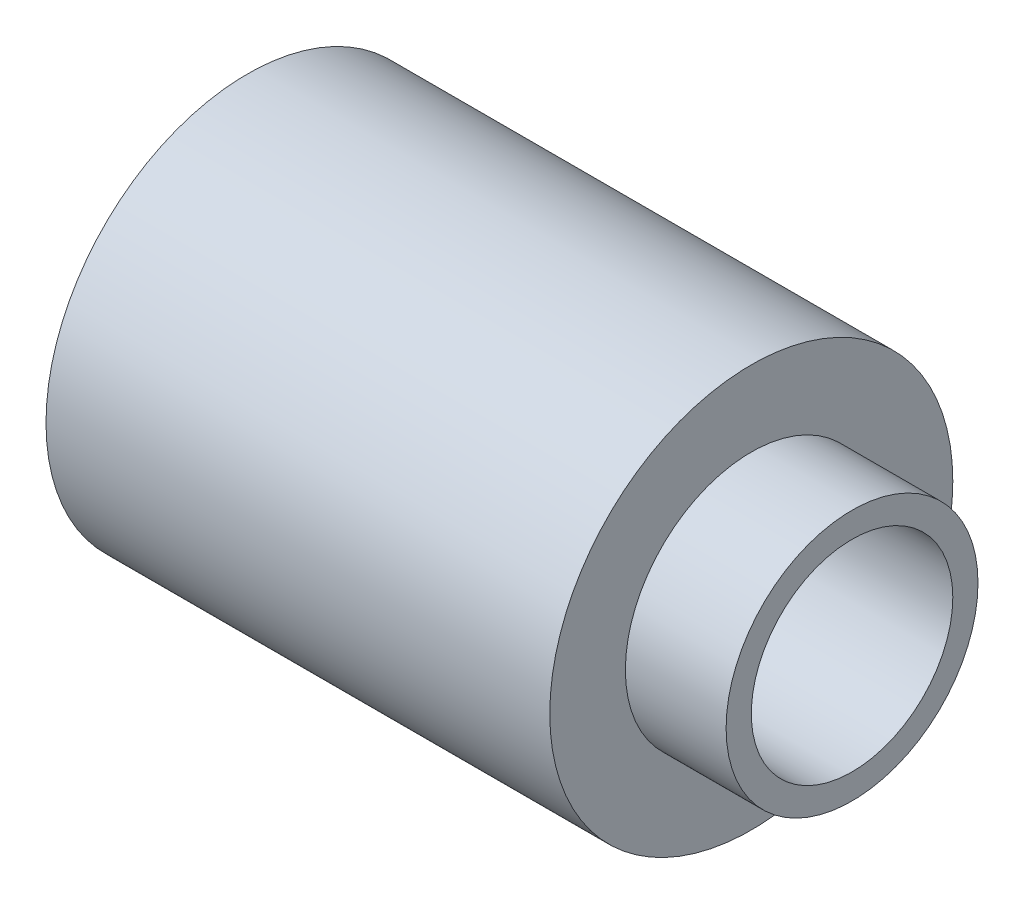
ISO-10303-21;
HEADER;
FILE_DESCRIPTION(('STEP AP214'),'2;1');
FILE_NAME('part.step','',(''),(''),'','','');
FILE_SCHEMA(('AUTOMOTIVE_DESIGN { 1 0 10303 214 1 1 1 1 }'));
ENDSEC;
DATA;
#1=APPLICATION_CONTEXT('core data for automotive mechanical design processes');
#2=APPLICATION_PROTOCOL_DEFINITION('international standard','automotive_design',2000,#1);
#3=PRODUCT_CONTEXT('',#1,'mechanical');
#4=PRODUCT('Part','Part','',(#3));
#5=PRODUCT_RELATED_PRODUCT_CATEGORY('part','',(#4));
#6=PRODUCT_DEFINITION_FORMATION('','',#4);
#7=PRODUCT_DEFINITION_CONTEXT('part definition',#1,'design');
#8=PRODUCT_DEFINITION('design','',#6,#7);
#9=PRODUCT_DEFINITION_SHAPE('','',#8);
#10=(LENGTH_UNIT() NAMED_UNIT(*) SI_UNIT(.MILLI.,.METRE.));
#11=(NAMED_UNIT(*) PLANE_ANGLE_UNIT() SI_UNIT($,.RADIAN.));
#12=(NAMED_UNIT(*) SI_UNIT($,.STERADIAN.) SOLID_ANGLE_UNIT());
#13=UNCERTAINTY_MEASURE_WITH_UNIT(LENGTH_MEASURE(1.E-05),#10,'distance_accuracy_value','');
#14=(GEOMETRIC_REPRESENTATION_CONTEXT(3) GLOBAL_UNCERTAINTY_ASSIGNED_CONTEXT((#13)) GLOBAL_UNIT_ASSIGNED_CONTEXT((#10,
#11,#12)) REPRESENTATION_CONTEXT('',''));
#15=CARTESIAN_POINT('',(0.,0.,0.));
#16=DIRECTION('',(0.,0.,1.));
#17=DIRECTION('',(1.,0.,0.));
#18=AXIS2_PLACEMENT_3D('',#15,#16,#17);
#19=CARTESIAN_POINT('',(10.,0.,0.));
#20=DIRECTION('',(1.,0.,0.));
#21=DIRECTION('',(0.,0.,-1.));
#22=AXIS2_PLACEMENT_3D('',#19,#20,#21);
#23=PLANE('',#22);
#24=CARTESIAN_POINT('',(10.,0.,0.));
#25=DIRECTION('',(1.,0.,0.));
#26=DIRECTION('',(0.,0.,-1.));
#27=AXIS2_PLACEMENT_3D('',#24,#25,#26);
#28=CIRCLE('',#27,4.);
#29=CARTESIAN_POINT('',(10.,0.,-4.));
#30=VERTEX_POINT('',#29);
#31=EDGE_CURVE('E10',#30,#30,#28,.T.);
#32=ORIENTED_EDGE('',*,*,#31,.T.);
#33=EDGE_LOOP('',(#32));
#34=FACE_BOUND('',#33,.T.);
#35=CARTESIAN_POINT('',(10.,0.,0.));
#36=DIRECTION('',(1.,0.,0.));
#37=DIRECTION('',(0.,0.,-1.));
#38=AXIS2_PLACEMENT_3D('',#35,#36,#37);
#39=CIRCLE('',#38,2.5);
#40=CARTESIAN_POINT('',(10.,0.,-2.5));
#41=VERTEX_POINT('',#40);
#42=EDGE_CURVE('E46',#41,#41,#39,.T.);
#43=ORIENTED_EDGE('',*,*,#42,.F.);
#44=EDGE_LOOP('',(#43));
#45=FACE_BOUND('',#44,.T.);
#46=ADVANCED_FACE('F30',(#34,#45),#23,.T.);
#47=CARTESIAN_POINT('',(0.,0.,0.));
#48=DIRECTION('',(1.,0.,0.));
#49=DIRECTION('',(0.,0.,-1.));
#50=AXIS2_PLACEMENT_3D('',#47,#48,#49);
#51=PLANE('',#50);
#52=CARTESIAN_POINT('',(0.,0.,0.));
#53=DIRECTION('',(1.,0.,0.));
#54=DIRECTION('',(0.,0.,-1.));
#55=AXIS2_PLACEMENT_3D('',#52,#53,#54);
#56=CIRCLE('',#55,4.);
#57=CARTESIAN_POINT('',(0.,0.,-4.));
#58=VERTEX_POINT('',#57);
#59=EDGE_CURVE('E34',#58,#58,#56,.T.);
#60=ORIENTED_EDGE('',*,*,#59,.F.);
#61=EDGE_LOOP('',(#60));
#62=FACE_BOUND('',#61,.T.);
#63=CARTESIAN_POINT('',(0.,0.,0.));
#64=DIRECTION('',(1.,0.,0.));
#65=DIRECTION('',(0.,0.,-1.));
#66=AXIS2_PLACEMENT_3D('',#63,#64,#65);
#67=CIRCLE('',#66,2.);
#68=CARTESIAN_POINT('',(0.,0.,-2.));
#69=VERTEX_POINT('',#68);
#70=EDGE_CURVE('E41',#69,#69,#67,.T.);
#71=ORIENTED_EDGE('',*,*,#70,.T.);
#72=EDGE_LOOP('',(#71));
#73=FACE_BOUND('',#72,.T.);
#74=ADVANCED_FACE('F71',(#62,#73),#51,.F.);
#75=CARTESIAN_POINT('',(10.,0.,0.));
#76=DIRECTION('',(-1.,0.,0.));
#77=DIRECTION('',(0.,0.,1.));
#78=AXIS2_PLACEMENT_3D('',#75,#76,#77);
#79=CYLINDRICAL_SURFACE('',#78,4.);
#80=ORIENTED_EDGE('',*,*,#31,.F.);
#81=EDGE_LOOP('',(#80));
#82=FACE_BOUND('',#81,.T.);
#83=ORIENTED_EDGE('',*,*,#59,.T.);
#84=EDGE_LOOP('',(#83));
#85=FACE_BOUND('',#84,.T.);
#86=ADVANCED_FACE('F32',(#82,#85),#79,.T.);
#87=CARTESIAN_POINT('',(10.,0.,0.));
#88=DIRECTION('',(-1.,0.,0.));
#89=DIRECTION('',(0.,0.,1.));
#90=AXIS2_PLACEMENT_3D('',#87,#88,#89);
#91=CYLINDRICAL_SURFACE('',#90,2.);
#92=ORIENTED_EDGE('',*,*,#70,.F.);
#93=EDGE_LOOP('',(#92));
#94=FACE_BOUND('',#93,.T.);
#95=CARTESIAN_POINT('',(12.,0.,0.));
#96=DIRECTION('',(1.,0.,0.));
#97=DIRECTION('',(0.,0.,-1.));
#98=AXIS2_PLACEMENT_3D('',#95,#96,#97);
#99=CIRCLE('',#98,2.);
#100=CARTESIAN_POINT('',(12.,0.,-2.));
#101=VERTEX_POINT('',#100);
#102=EDGE_CURVE('E49',#101,#101,#99,.T.);
#103=ORIENTED_EDGE('',*,*,#102,.T.);
#104=EDGE_LOOP('',(#103));
#105=FACE_BOUND('',#104,.T.);
#106=ADVANCED_FACE('F55',(#94,#105),#91,.F.);
#107=CARTESIAN_POINT('',(12.,0.,0.));
#108=DIRECTION('',(1.,0.,0.));
#109=DIRECTION('',(0.,0.,-1.));
#110=AXIS2_PLACEMENT_3D('',#107,#108,#109);
#111=PLANE('',#110);
#112=CARTESIAN_POINT('',(12.,0.,0.));
#113=DIRECTION('',(1.,0.,0.));
#114=DIRECTION('',(0.,0.,-1.));
#115=AXIS2_PLACEMENT_3D('',#112,#113,#114);
#116=CIRCLE('',#115,2.5);
#117=CARTESIAN_POINT('',(12.,0.,-2.5));
#118=VERTEX_POINT('',#117);
#119=EDGE_CURVE('E45',#118,#118,#116,.T.);
#120=ORIENTED_EDGE('',*,*,#119,.T.);
#121=EDGE_LOOP('',(#120));
#122=FACE_BOUND('',#121,.T.);
#123=ORIENTED_EDGE('',*,*,#102,.F.);
#124=EDGE_LOOP('',(#123));
#125=FACE_BOUND('',#124,.T.);
#126=ADVANCED_FACE('F57',(#122,#125),#111,.T.);
#127=CARTESIAN_POINT('',(12.,0.,0.));
#128=DIRECTION('',(-1.,0.,0.));
#129=DIRECTION('',(0.,0.,1.));
#130=AXIS2_PLACEMENT_3D('',#127,#128,#129);
#131=CYLINDRICAL_SURFACE('',#130,2.5);
#132=ORIENTED_EDGE('',*,*,#119,.F.);
#133=EDGE_LOOP('',(#132));
#134=FACE_BOUND('',#133,.T.);
#135=ORIENTED_EDGE('',*,*,#42,.T.);
#136=EDGE_LOOP('',(#135));
#137=FACE_BOUND('',#136,.T.);
#138=ADVANCED_FACE('F59',(#134,#137),#131,.T.);
#139=CLOSED_SHELL('',(#46,#74,#86,#106,#126,#138));
#140=MANIFOLD_SOLID_BREP('B2',#139);
#141=ADVANCED_BREP_SHAPE_REPRESENTATION('',(#18,#140),#14);
#142=SHAPE_DEFINITION_REPRESENTATION(#9,#141);
ENDSEC;
END-ISO-10303-21;
